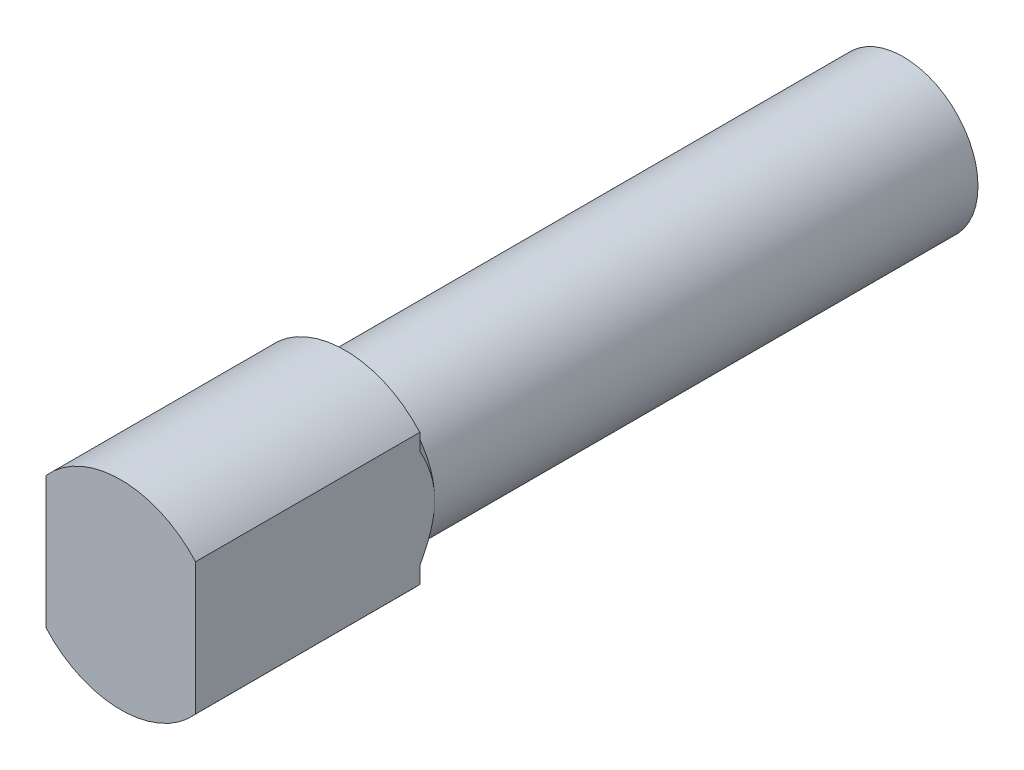
ISO-10303-21;
HEADER;
FILE_DESCRIPTION(('STEP AP214'),'2;1');
FILE_NAME('part.step','',(''),(''),'','','');
FILE_SCHEMA(('AUTOMOTIVE_DESIGN { 1 0 10303 214 1 1 1 1 }'));
ENDSEC;
DATA;
#1=APPLICATION_CONTEXT('core data for automotive mechanical design processes');
#2=APPLICATION_PROTOCOL_DEFINITION('international standard','automotive_design',2000,#1);
#3=PRODUCT_CONTEXT('',#1,'mechanical');
#4=PRODUCT('Part','Part','',(#3));
#5=PRODUCT_RELATED_PRODUCT_CATEGORY('part','',(#4));
#6=PRODUCT_DEFINITION_FORMATION('','',#4);
#7=PRODUCT_DEFINITION_CONTEXT('part definition',#1,'design');
#8=PRODUCT_DEFINITION('design','',#6,#7);
#9=PRODUCT_DEFINITION_SHAPE('','',#8);
#10=(LENGTH_UNIT() NAMED_UNIT(*) SI_UNIT(.MILLI.,.METRE.));
#11=(NAMED_UNIT(*) PLANE_ANGLE_UNIT() SI_UNIT($,.RADIAN.));
#12=(NAMED_UNIT(*) SI_UNIT($,.STERADIAN.) SOLID_ANGLE_UNIT());
#13=UNCERTAINTY_MEASURE_WITH_UNIT(LENGTH_MEASURE(1.E-05),#10,'distance_accuracy_value','');
#14=(GEOMETRIC_REPRESENTATION_CONTEXT(3) GLOBAL_UNCERTAINTY_ASSIGNED_CONTEXT((#13)) GLOBAL_UNIT_ASSIGNED_CONTEXT((#10,
#11,#12)) REPRESENTATION_CONTEXT('',''));
#15=CARTESIAN_POINT('',(0.,0.,0.));
#16=DIRECTION('',(0.,0.,1.));
#17=DIRECTION('',(1.,0.,0.));
#18=AXIS2_PLACEMENT_3D('',#15,#16,#17);
#19=CARTESIAN_POINT('',(0.,0.,112.));
#20=DIRECTION('',(0.,0.,1.));
#21=DIRECTION('',(1.,0.,0.));
#22=AXIS2_PLACEMENT_3D('',#19,#20,#21);
#23=PLANE('',#22);
#24=CARTESIAN_POINT('',(0.,0.,112.));
#25=DIRECTION('',(0.,0.,1.));
#26=DIRECTION('',(1.,0.,0.));
#27=AXIS2_PLACEMENT_3D('',#24,#25,#26);
#28=CIRCLE('',#27,20.);
#29=CARTESIAN_POINT('',(15.,13.228756555323,112.));
#30=VERTEX_POINT('',#29);
#31=CARTESIAN_POINT('',(-15.,13.228756555323,112.));
#32=VERTEX_POINT('',#31);
#33=EDGE_CURVE('E124',#30,#32,#28,.T.);
#34=ORIENTED_EDGE('',*,*,#33,.F.);
#35=DIRECTION('',(0.,-1.,0.));
#36=VECTOR('',#35,1.);
#37=CARTESIAN_POINT('',(15.,0.,112.));
#38=LINE('',#37,#36);
#39=CARTESIAN_POINT('',(15.,9.94987437106626,112.));
#40=VERTEX_POINT('',#39);
#41=EDGE_CURVE('E100',#30,#40,#38,.T.);
#42=ORIENTED_EDGE('',*,*,#41,.T.);
#43=CARTESIAN_POINT('',(0.,0.,112.));
#44=DIRECTION('',(0.,0.,1.));
#45=DIRECTION('',(1.,0.,0.));
#46=AXIS2_PLACEMENT_3D('',#43,#44,#45);
#47=CIRCLE('',#46,18.);
#48=CARTESIAN_POINT('',(-15.,9.94987437106626,112.));
#49=VERTEX_POINT('',#48);
#50=EDGE_CURVE('E59',#40,#49,#47,.T.);
#51=ORIENTED_EDGE('',*,*,#50,.T.);
#52=DIRECTION('',(0.,1.,0.));
#53=VECTOR('',#52,1.);
#54=CARTESIAN_POINT('',(-15.,0.,112.));
#55=LINE('',#54,#53);
#56=EDGE_CURVE('E177',#49,#32,#55,.T.);
#57=ORIENTED_EDGE('',*,*,#56,.T.);
#58=EDGE_LOOP('',(#34,#42,#51,#57));
#59=FACE_BOUND('',#58,.T.);
#60=ADVANCED_FACE('F31',(#59),#23,.F.);
#61=CARTESIAN_POINT('',(0.,0.,157.));
#62=DIRECTION('',(0.,0.,-1.));
#63=DIRECTION('',(-1.,0.,0.));
#64=AXIS2_PLACEMENT_3D('',#61,#62,#63);
#65=CYLINDRICAL_SURFACE('',#64,20.);
#66=CARTESIAN_POINT('',(0.,0.,157.));
#67=DIRECTION('',(0.,0.,1.));
#68=DIRECTION('',(1.,0.,0.));
#69=AXIS2_PLACEMENT_3D('',#66,#67,#68);
#70=CIRCLE('',#69,20.);
#71=CARTESIAN_POINT('',(15.,13.228756555323,157.));
#72=VERTEX_POINT('',#71);
#73=CARTESIAN_POINT('',(-15.,13.228756555323,157.));
#74=VERTEX_POINT('',#73);
#75=EDGE_CURVE('E111',#72,#74,#70,.T.);
#76=ORIENTED_EDGE('',*,*,#75,.F.);
#77=DIRECTION('',(0.,0.,-1.));
#78=VECTOR('',#77,1.);
#79=CARTESIAN_POINT('',(15.,13.228756555323,157.));
#80=LINE('',#79,#78);
#81=EDGE_CURVE('E95',#72,#30,#80,.T.);
#82=ORIENTED_EDGE('',*,*,#81,.T.);
#83=ORIENTED_EDGE('',*,*,#33,.T.);
#84=DIRECTION('',(0.,0.,-1.));
#85=VECTOR('',#84,1.);
#86=CARTESIAN_POINT('',(-15.,13.228756555323,157.));
#87=LINE('',#86,#85);
#88=EDGE_CURVE('E119',#32,#74,#87,.F.);
#89=ORIENTED_EDGE('',*,*,#88,.T.);
#90=EDGE_LOOP('',(#76,#82,#83,#89));
#91=FACE_BOUND('',#90,.T.);
#92=ADVANCED_FACE('F117',(#91),#65,.T.);
#93=CARTESIAN_POINT('',(0.,0.,112.));
#94=DIRECTION('',(0.,0.,1.));
#95=DIRECTION('',(1.,0.,0.));
#96=AXIS2_PLACEMENT_3D('',#93,#94,#95);
#97=CONICAL_SURFACE('',#96,18.,0.785398163397453);
#98=ORIENTED_EDGE('',*,*,#50,.F.);
#99=CARTESIAN_POINT('',(15.,-29.4219710097728,127.025026542001));
#100=CARTESIAN_POINT('',(15.,-29.0827951161201,126.72285832651));
#101=CARTESIAN_POINT('',(15.,-28.7430874668734,126.42128710574));
#102=CARTESIAN_POINT('',(15.,-28.0624989058774,125.819468207));
#103=CARTESIAN_POINT('',(15.,-27.7216179882347,125.519220535695));
#104=CARTESIAN_POINT('',(15.,-26.696988621685,124.620602787282));
#105=CARTESIAN_POINT('',(15.,-26.0113202638134,124.024417491672));
#106=CARTESIAN_POINT('',(15.,-24.6309094030193,122.836736275145));
#107=CARTESIAN_POINT('',(15.,-23.9361408951076,122.245270533483));
#108=CARTESIAN_POINT('',(15.,-22.539001077987,121.071443228047));
#109=CARTESIAN_POINT('',(15.,-21.8366301254248,120.489081240302));
#110=CARTESIAN_POINT('',(15.,-20.3800883912683,119.301368233475));
#111=CARTESIAN_POINT('',(15.,-19.6253344057403,118.696728956994));
#112=CARTESIAN_POINT('',(15.,-18.4830213687767,117.802651991709));
#113=CARTESIAN_POINT('',(15.,-18.1005201792432,117.506748558313));
#114=CARTESIAN_POINT('',(15.,-17.3316792888689,116.919976063944));
#115=CARTESIAN_POINT('',(15.,-16.9453396527479,116.629106918315));
#116=CARTESIAN_POINT('',(15.,-16.1689844013137,116.053758447594));
#117=CARTESIAN_POINT('',(15.,-15.7789765054832,115.769268720982));
#118=CARTESIAN_POINT('',(15.,-14.9939963763466,115.207188322197));
#119=CARTESIAN_POINT('',(15.,-14.5990240252221,114.929597814228));
#120=CARTESIAN_POINT('',(15.,-13.8035426945557,114.382698131043));
#121=CARTESIAN_POINT('',(15.,-13.4030353372802,114.113386600935));
#122=CARTESIAN_POINT('',(15.,-12.5956033210161,113.584588310744));
#123=CARTESIAN_POINT('',(15.,-12.18867914708,113.32510081305));
#124=CARTESIAN_POINT('',(15.,-11.489011430581,112.893008033167));
#125=CARTESIAN_POINT('',(15.,-11.1981129844836,112.717415339759));
#126=CARTESIAN_POINT('',(15.,-10.6123459326995,112.372962363557));
#127=CARTESIAN_POINT('',(15.,-10.3174773152092,112.204102100784));
#128=CARTESIAN_POINT('',(15.,-9.72332198267153,111.874058003259));
#129=CARTESIAN_POINT('',(15.,-9.42403368952327,111.712877001769));
#130=CARTESIAN_POINT('',(15.,-8.82081383677769,111.399435101779));
#131=CARTESIAN_POINT('',(15.,-8.5168823034429,111.247174152849));
#132=CARTESIAN_POINT('',(15.,-7.90671463607707,110.954207845293));
#133=CARTESIAN_POINT('',(15.,-7.60052146289893,110.813413587705));
#134=CARTESIAN_POINT('',(15.,-6.98305442164872,110.543455053896));
#135=CARTESIAN_POINT('',(15.,-6.67178015788447,110.414291688589));
#136=CARTESIAN_POINT('',(15.,-5.73040494654516,110.046933496663));
#137=CARTESIAN_POINT('',(15.,-5.09221410269421,109.828606301244));
#138=CARTESIAN_POINT('',(15.,-4.0075059804729,109.520460060489));
#139=CARTESIAN_POINT('',(15.,-3.56627013711608,109.411946773807));
#140=CARTESIAN_POINT('',(15.,-2.67638324459114,109.230682374144));
#141=CARTESIAN_POINT('',(15.,-2.22773348950451,109.157925086782));
#142=CARTESIAN_POINT('',(15.,-1.55217279905366,109.078437289867));
#143=CARTESIAN_POINT('',(15.,-1.32692876380304,109.056893963165));
#144=CARTESIAN_POINT('',(15.,-0.875699582547488,109.023856885623));
#145=CARTESIAN_POINT('',(15.,-0.649714473281531,109.012362643937));
#146=CARTESIAN_POINT('',(15.,-0.197467197343081,108.999596918577));
#147=CARTESIAN_POINT('',(15.,0.0287949531530849,108.998324864072));
#148=CARTESIAN_POINT('',(15.,0.481172444083988,109.006009268249));
#149=CARTESIAN_POINT('',(15.,0.707287750589939,109.014967575811));
#150=CARTESIAN_POINT('',(15.,1.38238541166507,109.056903041469));
#151=CARTESIAN_POINT('',(15.,1.8305125142599,109.104875412028));
#152=CARTESIAN_POINT('',(15.,2.72111991041443,109.238449349358));
#153=CARTESIAN_POINT('',(15.,3.16359883816527,109.324059846598));
#154=CARTESIAN_POINT('',(15.,3.82381898008835,109.478209969712));
#155=CARTESIAN_POINT('',(15.,4.0445634075762,109.534278986762));
#156=CARTESIAN_POINT('',(15.,4.48380633307981,109.654390276452));
#157=CARTESIAN_POINT('',(15.,4.70230550889055,109.718430061476));
#158=CARTESIAN_POINT('',(15.,5.13696557482614,109.853887805012));
#159=CARTESIAN_POINT('',(15.,5.35312675911897,109.925304823099));
#160=CARTESIAN_POINT('',(15.,5.78309880530367,110.074937673234));
#161=CARTESIAN_POINT('',(15.,5.99690939151872,110.153154293353));
#162=CARTESIAN_POINT('',(15.,6.7756284523585,110.4509993919));
#163=CARTESIAN_POINT('',(15.,7.33335930260174,110.689566264111));
#164=CARTESIAN_POINT('',(15.,8.43289096045818,111.201061453118));
#165=CARTESIAN_POINT('',(15.,8.97468283143254,111.474008609737));
#166=CARTESIAN_POINT('',(15.,10.0458788997813,112.047559013338));
#167=CARTESIAN_POINT('',(15.,10.5752305445658,112.348259756399));
#168=CARTESIAN_POINT('',(15.,11.621330392007,112.970466338899));
#169=CARTESIAN_POINT('',(15.,12.1380810154003,113.291968138272));
#170=CARTESIAN_POINT('',(15.,13.135443138072,113.934943937829));
#171=CARTESIAN_POINT('',(15.,13.6165717641646,114.255619819318));
#172=CARTESIAN_POINT('',(15.,14.5706669319958,114.908933199974));
#173=CARTESIAN_POINT('',(15.,15.0436328151473,115.241571657692));
#174=CARTESIAN_POINT('',(15.,15.9784138797567,115.913582985959));
#175=CARTESIAN_POINT('',(15.,16.4402906666256,116.252870359861));
#176=CARTESIAN_POINT('',(15.,17.128616668727,116.767660690571));
#177=CARTESIAN_POINT('',(15.,17.3572823361504,116.940212206036));
#178=CARTESIAN_POINT('',(15.,17.8132395894296,117.287113181837));
#179=CARTESIAN_POINT('',(15.,18.0405312000062,117.461462609674));
#180=CARTESIAN_POINT('',(15.,18.2671911928195,117.636629922115));
#181=B_SPLINE_CURVE_WITH_KNOTS('',3,(#99,#100,#101,#102,#103,#104,#105,#106,#107,#108,#109,#110,
#111,#112,#113,#114,#115,#116,#117,#118,#119,#120,#121,#122,#123,#124,#125,#126,#127,#128,#129,
#130,#131,#132,#133,#134,#135,#136,#137,#138,#139,#140,#141,#142,#143,#144,#145,#146,#147,#148,
#149,#150,#151,#152,#153,#154,#155,#156,#157,#158,#159,#160,#161,#162,#163,#164,#165,#166,#167,
#168,#169,#170,#171,#172,#173,#174,#175,#176,#177,#178,#179,#180),.UNSPECIFIED.,.F.,.F.,(4,2,2,
2,2,2,2,2,2,2,2,2,2,2,2,2,2,2,2,2,2,2,2,2,2,2,2,2,2,2,2,2,2,2,2,2,2,2,2,2,4),(0.,
1.36275820596227,2.72552326728336,5.45132157025507,8.18855899697113,10.9256685658865,
13.8266879791848,15.2774459974416,16.7281795959487,18.1763446377578,19.6245441131355,
21.0723277741966,22.5200025157361,23.5392855792352,24.5585716737873,25.5782309668819,
26.5978844948372,27.6086796329924,28.6195538663968,30.6395102005022,32.001477349483,
33.3632092299593,34.0418387663373,34.7204351532584,35.398993645571,36.0776747895738,
37.4278818624975,38.7784094746988,39.4615449290212,40.1444677138869,40.8273035492035,
41.5102186306751,43.3283385242867,45.1474590873832,46.97323274549,48.798652852709,
50.5330435533113,52.2675735400967,53.9867743786503,54.8461612368142,55.7055325873544),.UNSPECIFIED.);
#182=CARTESIAN_POINT('',(15.,0.,109.));
#183=VERTEX_POINT('',#182);
#184=EDGE_CURVE('E11',#40,#183,#181,.F.);
#185=ORIENTED_EDGE('',*,*,#184,.T.);
#186=CARTESIAN_POINT('',(0.,0.,109.));
#187=DIRECTION('',(0.,0.,1.));
#188=DIRECTION('',(1.,0.,0.));
#189=AXIS2_PLACEMENT_3D('',#186,#187,#188);
#190=CIRCLE('',#189,15.);
#191=CARTESIAN_POINT('',(-15.,0.,109.));
#192=VERTEX_POINT('',#191);
#193=EDGE_CURVE('E136',#192,#183,#190,.F.);
#194=ORIENTED_EDGE('',*,*,#193,.F.);
#195=CARTESIAN_POINT('',(-15.,-29.4219710097728,127.025026542001));
#196=CARTESIAN_POINT('',(-15.,-29.0827951161201,126.72285832651));
#197=CARTESIAN_POINT('',(-15.,-28.7430874668734,126.42128710574));
#198=CARTESIAN_POINT('',(-15.,-28.0624989058774,125.819468207));
#199=CARTESIAN_POINT('',(-15.,-27.7216179882347,125.519220535695));
#200=CARTESIAN_POINT('',(-15.,-26.696988621685,124.620602787282));
#201=CARTESIAN_POINT('',(-15.,-26.0113202638134,124.024417491672));
#202=CARTESIAN_POINT('',(-15.,-24.6309094030193,122.836736275145));
#203=CARTESIAN_POINT('',(-15.,-23.9361408951076,122.245270533483));
#204=CARTESIAN_POINT('',(-15.,-22.539001077987,121.071443228047));
#205=CARTESIAN_POINT('',(-15.,-21.8366301254248,120.489081240302));
#206=CARTESIAN_POINT('',(-15.,-20.3800883912683,119.301368233475));
#207=CARTESIAN_POINT('',(-15.,-19.6253344057403,118.696728956994));
#208=CARTESIAN_POINT('',(-15.,-18.4830213687767,117.802651991709));
#209=CARTESIAN_POINT('',(-15.,-18.1005201792432,117.506748558313));
#210=CARTESIAN_POINT('',(-15.,-17.3316792888689,116.919976063944));
#211=CARTESIAN_POINT('',(-15.,-16.9453396527479,116.629106918315));
#212=CARTESIAN_POINT('',(-15.,-16.1689844013137,116.053758447594));
#213=CARTESIAN_POINT('',(-15.,-15.7789765054832,115.769268720982));
#214=CARTESIAN_POINT('',(-15.,-14.9939963763466,115.207188322197));
#215=CARTESIAN_POINT('',(-15.,-14.5990240252221,114.929597814228));
#216=CARTESIAN_POINT('',(-15.,-13.8035426945557,114.382698131043));
#217=CARTESIAN_POINT('',(-15.,-13.4030353372802,114.113386600935));
#218=CARTESIAN_POINT('',(-15.,-12.5956033210161,113.584588310744));
#219=CARTESIAN_POINT('',(-15.,-12.18867914708,113.32510081305));
#220=CARTESIAN_POINT('',(-15.,-11.489011430581,112.893008033167));
#221=CARTESIAN_POINT('',(-15.,-11.1981129844836,112.717415339759));
#222=CARTESIAN_POINT('',(-15.,-10.6123459326995,112.372962363557));
#223=CARTESIAN_POINT('',(-15.,-10.3174773152092,112.204102100784));
#224=CARTESIAN_POINT('',(-15.,-9.72332198267153,111.874058003259));
#225=CARTESIAN_POINT('',(-15.,-9.42403368952327,111.712877001769));
#226=CARTESIAN_POINT('',(-15.,-8.82081383677769,111.399435101779));
#227=CARTESIAN_POINT('',(-15.,-8.5168823034429,111.247174152849));
#228=CARTESIAN_POINT('',(-15.,-7.90671463607707,110.954207845293));
#229=CARTESIAN_POINT('',(-15.,-7.60052146289893,110.813413587705));
#230=CARTESIAN_POINT('',(-15.,-6.98305442164872,110.543455053896));
#231=CARTESIAN_POINT('',(-15.,-6.67178015788447,110.414291688589));
#232=CARTESIAN_POINT('',(-15.,-5.73040494654516,110.046933496663));
#233=CARTESIAN_POINT('',(-15.,-5.09221410269421,109.828606301244));
#234=CARTESIAN_POINT('',(-15.,-4.0075059804729,109.520460060489));
#235=CARTESIAN_POINT('',(-15.,-3.56627013711608,109.411946773807));
#236=CARTESIAN_POINT('',(-15.,-2.67638324459114,109.230682374144));
#237=CARTESIAN_POINT('',(-15.,-2.22773348950451,109.157925086782));
#238=CARTESIAN_POINT('',(-15.,-1.55217279905366,109.078437289867));
#239=CARTESIAN_POINT('',(-15.,-1.32692876380304,109.056893963165));
#240=CARTESIAN_POINT('',(-15.,-0.875699582547488,109.023856885623));
#241=CARTESIAN_POINT('',(-15.,-0.649714473281531,109.012362643937));
#242=CARTESIAN_POINT('',(-15.,-0.197467197343081,108.999596918577));
#243=CARTESIAN_POINT('',(-15.,0.0287949531530849,108.998324864072));
#244=CARTESIAN_POINT('',(-15.,0.481172444083988,109.006009268249));
#245=CARTESIAN_POINT('',(-15.,0.707287750589939,109.014967575811));
#246=CARTESIAN_POINT('',(-15.,1.38238541166507,109.056903041469));
#247=CARTESIAN_POINT('',(-15.,1.8305125142599,109.104875412028));
#248=CARTESIAN_POINT('',(-15.,2.72111991041443,109.238449349358));
#249=CARTESIAN_POINT('',(-15.,3.16359883816527,109.324059846598));
#250=CARTESIAN_POINT('',(-15.,3.82381898008835,109.478209969712));
#251=CARTESIAN_POINT('',(-15.,4.0445634075762,109.534278986762));
#252=CARTESIAN_POINT('',(-15.,4.48380633307981,109.654390276452));
#253=CARTESIAN_POINT('',(-15.,4.70230550889055,109.718430061476));
#254=CARTESIAN_POINT('',(-15.,5.13696557482614,109.853887805012));
#255=CARTESIAN_POINT('',(-15.,5.35312675911897,109.925304823099));
#256=CARTESIAN_POINT('',(-15.,5.78309880530367,110.074937673234));
#257=CARTESIAN_POINT('',(-15.,5.99690939151872,110.153154293353));
#258=CARTESIAN_POINT('',(-15.,6.7756284523585,110.4509993919));
#259=CARTESIAN_POINT('',(-15.,7.33335930260174,110.689566264111));
#260=CARTESIAN_POINT('',(-15.,8.43289096045818,111.201061453118));
#261=CARTESIAN_POINT('',(-15.,8.97468283143254,111.474008609737));
#262=CARTESIAN_POINT('',(-15.,10.0458788997813,112.047559013338));
#263=CARTESIAN_POINT('',(-15.,10.5752305445658,112.348259756399));
#264=CARTESIAN_POINT('',(-15.,11.621330392007,112.970466338899));
#265=CARTESIAN_POINT('',(-15.,12.1380810154003,113.291968138272));
#266=CARTESIAN_POINT('',(-15.,13.135443138072,113.934943937829));
#267=CARTESIAN_POINT('',(-15.,13.6165717641646,114.255619819318));
#268=CARTESIAN_POINT('',(-15.,14.5706669319958,114.908933199974));
#269=CARTESIAN_POINT('',(-15.,15.0436328151473,115.241571657692));
#270=CARTESIAN_POINT('',(-15.,15.9784138797567,115.913582985959));
#271=CARTESIAN_POINT('',(-15.,16.4402906666256,116.252870359861));
#272=CARTESIAN_POINT('',(-15.,17.128616668727,116.767660690571));
#273=CARTESIAN_POINT('',(-15.,17.3572823361504,116.940212206036));
#274=CARTESIAN_POINT('',(-15.,17.8132395894296,117.287113181837));
#275=CARTESIAN_POINT('',(-15.,18.0405312000062,117.461462609674));
#276=CARTESIAN_POINT('',(-15.,18.2671911928195,117.636629922115));
#277=B_SPLINE_CURVE_WITH_KNOTS('',3,(#195,#196,#197,#198,#199,#200,#201,#202,#203,#204,#205,
#206,#207,#208,#209,#210,#211,#212,#213,#214,#215,#216,#217,#218,#219,#220,#221,#222,#223,#224,
#225,#226,#227,#228,#229,#230,#231,#232,#233,#234,#235,#236,#237,#238,#239,#240,#241,#242,#243,
#244,#245,#246,#247,#248,#249,#250,#251,#252,#253,#254,#255,#256,#257,#258,#259,#260,#261,#262,
#263,#264,#265,#266,#267,#268,#269,#270,#271,#272,#273,#274,#275,#276),.UNSPECIFIED.,.F.,.F.,(4,
2,2,2,2,2,2,2,2,2,2,2,2,2,2,2,2,2,2,2,2,2,2,2,2,2,2,2,2,2,2,2,2,2,2,2,2,2,2,2,4),(0.,
1.36275820596227,2.72552326728336,5.45132157025507,8.18855899697113,10.9256685658865,
13.8266879791848,15.2774459974416,16.7281795959487,18.1763446377578,19.6245441131355,
21.0723277741966,22.5200025157361,23.5392855792352,24.5585716737873,25.5782309668819,
26.5978844948372,27.6086796329924,28.6195538663968,30.6395102005022,32.001477349483,
33.3632092299593,34.0418387663373,34.7204351532584,35.398993645571,36.0776747895738,
37.4278818624975,38.7784094746988,39.4615449290212,40.1444677138869,40.8273035492035,
41.5102186306751,43.3283385242867,45.1474590873832,46.97323274549,48.798652852709,
50.5330435533113,52.2675735400967,53.9867743786503,54.8461612368142,55.7055325873544),.UNSPECIFIED.);
#278=EDGE_CURVE('E138',#192,#49,#277,.T.);
#279=ORIENTED_EDGE('',*,*,#278,.T.);
#280=EDGE_LOOP('',(#98,#185,#194,#279));
#281=FACE_BOUND('',#280,.T.);
#282=ADVANCED_FACE('F166',(#281),#97,.T.);
#283=CARTESIAN_POINT('',(0.,0.,112.));
#284=DIRECTION('',(0.,0.,-1.));
#285=DIRECTION('',(-1.,0.,0.));
#286=AXIS2_PLACEMENT_3D('',#283,#284,#285);
#287=CYLINDRICAL_SURFACE('',#286,15.);
#288=CARTESIAN_POINT('',(0.,0.,0.));
#289=DIRECTION('',(0.,0.,1.));
#290=DIRECTION('',(1.,0.,0.));
#291=AXIS2_PLACEMENT_3D('',#288,#289,#290);
#292=CIRCLE('',#291,15.);
#293=CARTESIAN_POINT('',(15.,0.,0.));
#294=VERTEX_POINT('',#293);
#295=EDGE_CURVE('E122',#294,#294,#292,.T.);
#296=ORIENTED_EDGE('',*,*,#295,.T.);
#297=EDGE_LOOP('',(#296));
#298=FACE_BOUND('',#297,.T.);
#299=ORIENTED_EDGE('',*,*,#193,.T.);
#300=EDGE_CURVE('E135',#183,#192,#190,.F.);
#301=ORIENTED_EDGE('',*,*,#300,.T.);
#302=EDGE_LOOP('',(#299,#301));
#303=FACE_BOUND('',#302,.T.);
#304=ADVANCED_FACE('F163',(#298,#303),#287,.T.);
#305=CARTESIAN_POINT('',(0.,0.,0.));
#306=DIRECTION('',(0.,0.,1.));
#307=DIRECTION('',(1.,0.,0.));
#308=AXIS2_PLACEMENT_3D('',#305,#306,#307);
#309=PLANE('',#308);
#310=ORIENTED_EDGE('',*,*,#295,.F.);
#311=EDGE_LOOP('',(#310));
#312=FACE_BOUND('',#311,.T.);
#313=ADVANCED_FACE('F157',(#312),#309,.F.);
#314=CARTESIAN_POINT('',(-15.,-9.94987437106626,112.));
#315=VERTEX_POINT('',#314);
#316=CARTESIAN_POINT('',(15.,-9.94987437106626,112.));
#317=VERTEX_POINT('',#316);
#318=EDGE_CURVE('E132',#315,#317,#47,.T.);
#319=ORIENTED_EDGE('',*,*,#318,.T.);
#320=CARTESIAN_POINT('',(15.,-13.228756555323,112.));
#321=VERTEX_POINT('',#320);
#322=EDGE_CURVE('E51',#317,#321,#38,.T.);
#323=ORIENTED_EDGE('',*,*,#322,.T.);
#324=CARTESIAN_POINT('',(-15.,-13.228756555323,112.));
#325=VERTEX_POINT('',#324);
#326=EDGE_CURVE('E120',#325,#321,#28,.T.);
#327=ORIENTED_EDGE('',*,*,#326,.F.);
#328=EDGE_CURVE('E180',#325,#315,#55,.T.);
#329=ORIENTED_EDGE('',*,*,#328,.T.);
#330=EDGE_LOOP('',(#319,#323,#327,#329));
#331=FACE_BOUND('',#330,.T.);
#332=ADVANCED_FACE('F154',(#331),#23,.F.);
#333=ORIENTED_EDGE('',*,*,#326,.T.);
#334=DIRECTION('',(0.,0.,-1.));
#335=VECTOR('',#334,1.);
#336=CARTESIAN_POINT('',(15.,-13.228756555323,157.));
#337=LINE('',#336,#335);
#338=CARTESIAN_POINT('',(15.,-13.228756555323,157.));
#339=VERTEX_POINT('',#338);
#340=EDGE_CURVE('E105',#321,#339,#337,.F.);
#341=ORIENTED_EDGE('',*,*,#340,.T.);
#342=CARTESIAN_POINT('',(-15.,-13.228756555323,157.));
#343=VERTEX_POINT('',#342);
#344=EDGE_CURVE('E114',#343,#339,#70,.T.);
#345=ORIENTED_EDGE('',*,*,#344,.F.);
#346=DIRECTION('',(0.,0.,-1.));
#347=VECTOR('',#346,1.);
#348=CARTESIAN_POINT('',(-15.,-13.228756555323,157.));
#349=LINE('',#348,#347);
#350=EDGE_CURVE('E127',#343,#325,#349,.T.);
#351=ORIENTED_EDGE('',*,*,#350,.T.);
#352=EDGE_LOOP('',(#333,#341,#345,#351));
#353=FACE_BOUND('',#352,.T.);
#354=ADVANCED_FACE('F153',(#353),#65,.T.);
#355=CARTESIAN_POINT('',(0.,0.,157.));
#356=DIRECTION('',(0.,0.,1.));
#357=DIRECTION('',(1.,0.,0.));
#358=AXIS2_PLACEMENT_3D('',#355,#356,#357);
#359=PLANE('',#358);
#360=DIRECTION('',(0.,-1.,0.));
#361=VECTOR('',#360,1.);
#362=CARTESIAN_POINT('',(15.,20.7648811578202,157.));
#363=LINE('',#362,#361);
#364=EDGE_CURVE('E98',#72,#339,#363,.T.);
#365=ORIENTED_EDGE('',*,*,#364,.F.);
#366=ORIENTED_EDGE('',*,*,#75,.T.);
#367=DIRECTION('',(0.,1.,0.));
#368=VECTOR('',#367,1.);
#369=CARTESIAN_POINT('',(-15.,20.7648811578202,157.));
#370=LINE('',#369,#368);
#371=EDGE_CURVE('E104',#343,#74,#370,.T.);
#372=ORIENTED_EDGE('',*,*,#371,.F.);
#373=ORIENTED_EDGE('',*,*,#344,.T.);
#374=EDGE_LOOP('',(#365,#366,#372,#373));
#375=FACE_BOUND('',#374,.T.);
#376=ADVANCED_FACE('F109',(#375),#359,.T.);
#377=ORIENTED_EDGE('',*,*,#300,.F.);
#378=EDGE_CURVE('E36',#183,#317,#181,.F.);
#379=ORIENTED_EDGE('',*,*,#378,.T.);
#380=ORIENTED_EDGE('',*,*,#318,.F.);
#381=EDGE_CURVE('E144',#315,#192,#277,.T.);
#382=ORIENTED_EDGE('',*,*,#381,.T.);
#383=EDGE_LOOP('',(#377,#379,#380,#382));
#384=FACE_BOUND('',#383,.T.);
#385=ADVANCED_FACE('F33',(#384),#97,.T.);
#386=CARTESIAN_POINT('',(-15.,20.7648811578202,0.));
#387=DIRECTION('',(1.,0.,0.));
#388=DIRECTION('',(0.,1.,0.));
#389=AXIS2_PLACEMENT_3D('',#386,#387,#388);
#390=PLANE('',#389);
#391=ORIENTED_EDGE('',*,*,#371,.T.);
#392=ORIENTED_EDGE('',*,*,#88,.F.);
#393=ORIENTED_EDGE('',*,*,#56,.F.);
#394=ORIENTED_EDGE('',*,*,#278,.F.);
#395=ORIENTED_EDGE('',*,*,#381,.F.);
#396=ORIENTED_EDGE('',*,*,#328,.F.);
#397=ORIENTED_EDGE('',*,*,#350,.F.);
#398=EDGE_LOOP('',(#391,#392,#393,#394,#395,#396,#397));
#399=FACE_BOUND('',#398,.T.);
#400=ADVANCED_FACE('F145',(#399),#390,.F.);
#401=CARTESIAN_POINT('',(15.,20.7648811578202,0.));
#402=DIRECTION('',(-1.,0.,0.));
#403=DIRECTION('',(0.,-1.,0.));
#404=AXIS2_PLACEMENT_3D('',#401,#402,#403);
#405=PLANE('',#404);
#406=ORIENTED_EDGE('',*,*,#364,.T.);
#407=ORIENTED_EDGE('',*,*,#340,.F.);
#408=ORIENTED_EDGE('',*,*,#322,.F.);
#409=ORIENTED_EDGE('',*,*,#378,.F.);
#410=ORIENTED_EDGE('',*,*,#184,.F.);
#411=ORIENTED_EDGE('',*,*,#41,.F.);
#412=ORIENTED_EDGE('',*,*,#81,.F.);
#413=EDGE_LOOP('',(#406,#407,#408,#409,#410,#411,#412));
#414=FACE_BOUND('',#413,.T.);
#415=ADVANCED_FACE('F97',(#414),#405,.F.);
#416=CLOSED_SHELL('',(#60,#92,#282,#304,#313,#332,#354,#376,#385,#400,#415));
#417=MANIFOLD_SOLID_BREP('B2',#416);
#418=ADVANCED_BREP_SHAPE_REPRESENTATION('',(#18,#417),#14);
#419=SHAPE_DEFINITION_REPRESENTATION(#9,#418);
ENDSEC;
END-ISO-10303-21;
